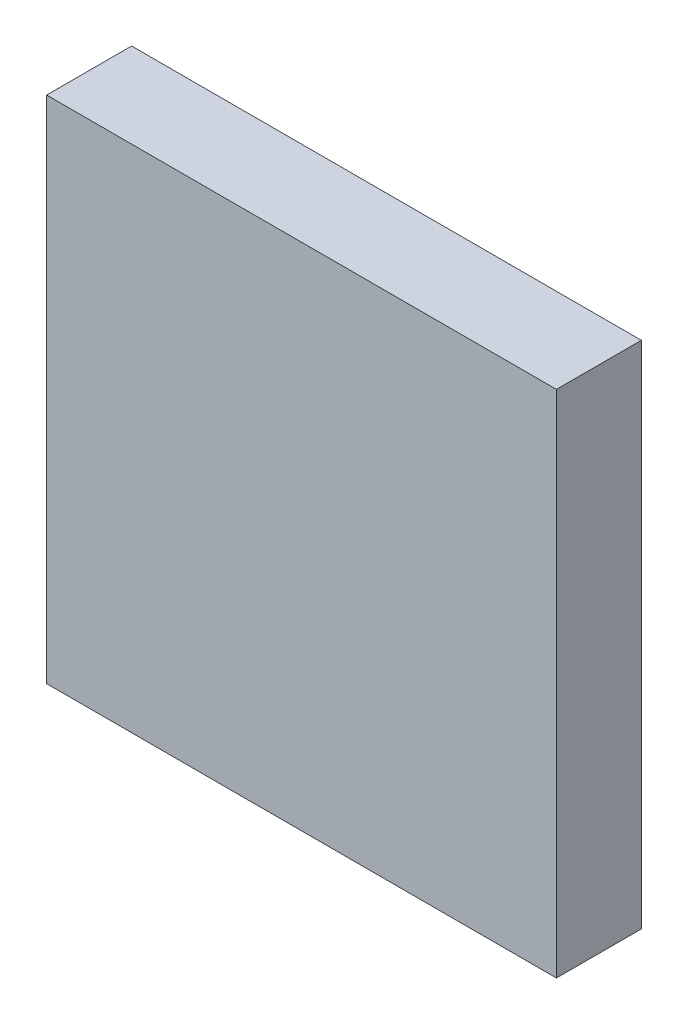
ISO-10303-21;
HEADER;
FILE_DESCRIPTION(('STEP AP214'),'2;1');
FILE_NAME('part.step','',(''),(''),'','','');
FILE_SCHEMA(('AUTOMOTIVE_DESIGN { 1 0 10303 214 1 1 1 1 }'));
ENDSEC;
DATA;
#1=APPLICATION_CONTEXT('core data for automotive mechanical design processes');
#2=APPLICATION_PROTOCOL_DEFINITION('international standard','automotive_design',2000,#1);
#3=PRODUCT_CONTEXT('',#1,'mechanical');
#4=PRODUCT('Part','Part','',(#3));
#5=PRODUCT_RELATED_PRODUCT_CATEGORY('part','',(#4));
#6=PRODUCT_DEFINITION_FORMATION('','',#4);
#7=PRODUCT_DEFINITION_CONTEXT('part definition',#1,'design');
#8=PRODUCT_DEFINITION('design','',#6,#7);
#9=PRODUCT_DEFINITION_SHAPE('','',#8);
#10=(LENGTH_UNIT() NAMED_UNIT(*) SI_UNIT(.MILLI.,.METRE.));
#11=(NAMED_UNIT(*) PLANE_ANGLE_UNIT() SI_UNIT($,.RADIAN.));
#12=(NAMED_UNIT(*) SI_UNIT($,.STERADIAN.) SOLID_ANGLE_UNIT());
#13=UNCERTAINTY_MEASURE_WITH_UNIT(LENGTH_MEASURE(1.E-05),#10,'distance_accuracy_value','');
#14=(GEOMETRIC_REPRESENTATION_CONTEXT(3) GLOBAL_UNCERTAINTY_ASSIGNED_CONTEXT((#13)) GLOBAL_UNIT_ASSIGNED_CONTEXT((#10,
#11,#12)) REPRESENTATION_CONTEXT('',''));
#15=CARTESIAN_POINT('',(0.,0.,0.));
#16=DIRECTION('',(0.,0.,1.));
#17=DIRECTION('',(1.,0.,0.));
#18=AXIS2_PLACEMENT_3D('',#15,#16,#17);
#19=CARTESIAN_POINT('',(-6.,-6.,0.));
#20=DIRECTION('',(0.,0.,1.));
#21=DIRECTION('',(1.,0.,0.));
#22=AXIS2_PLACEMENT_3D('',#19,#20,#21);
#23=PLANE('',#22);
#24=DIRECTION('',(0.,-1.,0.));
#25=VECTOR('',#24,1.);
#26=CARTESIAN_POINT('',(-6.,6.,0.));
#27=LINE('',#26,#25);
#28=CARTESIAN_POINT('',(-6.,6.,0.));
#29=VERTEX_POINT('',#28);
#30=CARTESIAN_POINT('',(-6.,-6.,0.));
#31=VERTEX_POINT('',#30);
#32=EDGE_CURVE('E117',#29,#31,#27,.T.);
#33=ORIENTED_EDGE('',*,*,#32,.F.);
#34=DIRECTION('',(-1.,0.,0.));
#35=VECTOR('',#34,1.);
#36=CARTESIAN_POINT('',(-6.,6.,0.));
#37=LINE('',#36,#35);
#38=CARTESIAN_POINT('',(6.,6.,0.));
#39=VERTEX_POINT('',#38);
#40=EDGE_CURVE('E130',#39,#29,#37,.T.);
#41=ORIENTED_EDGE('',*,*,#40,.F.);
#42=DIRECTION('',(0.,1.,0.));
#43=VECTOR('',#42,1.);
#44=CARTESIAN_POINT('',(6.,6.,0.));
#45=LINE('',#44,#43);
#46=CARTESIAN_POINT('',(6.,-6.,0.));
#47=VERTEX_POINT('',#46);
#48=EDGE_CURVE('E138',#47,#39,#45,.T.);
#49=ORIENTED_EDGE('',*,*,#48,.F.);
#50=DIRECTION('',(1.,0.,0.));
#51=VECTOR('',#50,1.);
#52=CARTESIAN_POINT('',(-6.,-6.,0.));
#53=LINE('',#52,#51);
#54=EDGE_CURVE('E120',#31,#47,#53,.T.);
#55=ORIENTED_EDGE('',*,*,#54,.F.);
#56=EDGE_LOOP('',(#33,#41,#49,#55));
#57=FACE_BOUND('',#56,.T.);
#58=DIRECTION('',(0.,-1.,0.));
#59=VECTOR('',#58,1.);
#60=CARTESIAN_POINT('',(2.,2.,0.));
#61=LINE('',#60,#59);
#62=CARTESIAN_POINT('',(2.,2.,0.));
#63=VERTEX_POINT('',#62);
#64=CARTESIAN_POINT('',(2.,-2.,0.));
#65=VERTEX_POINT('',#64);
#66=EDGE_CURVE('E116',#63,#65,#61,.T.);
#67=ORIENTED_EDGE('',*,*,#66,.F.);
#68=DIRECTION('',(1.,0.,0.));
#69=VECTOR('',#68,1.);
#70=CARTESIAN_POINT('',(2.,2.,0.));
#71=LINE('',#70,#69);
#72=CARTESIAN_POINT('',(-2.,2.,0.));
#73=VERTEX_POINT('',#72);
#74=EDGE_CURVE('E113',#73,#63,#71,.T.);
#75=ORIENTED_EDGE('',*,*,#74,.F.);
#76=DIRECTION('',(0.,1.,0.));
#77=VECTOR('',#76,1.);
#78=CARTESIAN_POINT('',(-2.,2.,0.));
#79=LINE('',#78,#77);
#80=CARTESIAN_POINT('',(-2.,-2.,0.));
#81=VERTEX_POINT('',#80);
#82=EDGE_CURVE('E51',#81,#73,#79,.T.);
#83=ORIENTED_EDGE('',*,*,#82,.F.);
#84=DIRECTION('',(-1.,0.,0.));
#85=VECTOR('',#84,1.);
#86=CARTESIAN_POINT('',(2.,-2.,0.));
#87=LINE('',#86,#85);
#88=EDGE_CURVE('E46',#65,#81,#87,.T.);
#89=ORIENTED_EDGE('',*,*,#88,.F.);
#90=EDGE_LOOP('',(#67,#75,#83,#89));
#91=FACE_BOUND('',#90,.T.);
#92=ADVANCED_FACE('F31',(#57,#91),#23,.F.);
#93=CARTESIAN_POINT('',(-6.,6.,2.));
#94=DIRECTION('',(1.,0.,0.));
#95=DIRECTION('',(0.,1.,0.));
#96=AXIS2_PLACEMENT_3D('',#93,#94,#95);
#97=PLANE('',#96);
#98=ORIENTED_EDGE('',*,*,#32,.T.);
#99=DIRECTION('',(0.,0.,-1.));
#100=VECTOR('',#99,1.);
#101=CARTESIAN_POINT('',(-6.,-6.,2.));
#102=LINE('',#101,#100);
#103=CARTESIAN_POINT('',(-6.,-6.,2.));
#104=VERTEX_POINT('',#103);
#105=EDGE_CURVE('E11',#104,#31,#102,.T.);
#106=ORIENTED_EDGE('',*,*,#105,.F.);
#107=DIRECTION('',(0.,-1.,0.));
#108=VECTOR('',#107,1.);
#109=CARTESIAN_POINT('',(-6.,6.,2.));
#110=LINE('',#109,#108);
#111=CARTESIAN_POINT('',(-6.,6.,2.));
#112=VERTEX_POINT('',#111);
#113=EDGE_CURVE('E126',#112,#104,#110,.T.);
#114=ORIENTED_EDGE('',*,*,#113,.F.);
#115=DIRECTION('',(0.,0.,-1.));
#116=VECTOR('',#115,1.);
#117=CARTESIAN_POINT('',(-6.,6.,2.));
#118=LINE('',#117,#116);
#119=EDGE_CURVE('E135',#112,#29,#118,.T.);
#120=ORIENTED_EDGE('',*,*,#119,.T.);
#121=EDGE_LOOP('',(#98,#106,#114,#120));
#122=FACE_BOUND('',#121,.T.);
#123=ADVANCED_FACE('F33',(#122),#97,.F.);
#124=CARTESIAN_POINT('',(-6.,-6.,2.));
#125=DIRECTION('',(0.,1.,0.));
#126=DIRECTION('',(0.,0.,1.));
#127=AXIS2_PLACEMENT_3D('',#124,#125,#126);
#128=PLANE('',#127);
#129=ORIENTED_EDGE('',*,*,#54,.T.);
#130=DIRECTION('',(0.,0.,-1.));
#131=VECTOR('',#130,1.);
#132=CARTESIAN_POINT('',(6.,-6.,2.));
#133=LINE('',#132,#131);
#134=CARTESIAN_POINT('',(6.,-6.,2.));
#135=VERTEX_POINT('',#134);
#136=EDGE_CURVE('E39',#135,#47,#133,.T.);
#137=ORIENTED_EDGE('',*,*,#136,.F.);
#138=DIRECTION('',(1.,0.,0.));
#139=VECTOR('',#138,1.);
#140=CARTESIAN_POINT('',(-6.,-6.,2.));
#141=LINE('',#140,#139);
#142=EDGE_CURVE('E129',#104,#135,#141,.T.);
#143=ORIENTED_EDGE('',*,*,#142,.F.);
#144=ORIENTED_EDGE('',*,*,#105,.T.);
#145=EDGE_LOOP('',(#129,#137,#143,#144));
#146=FACE_BOUND('',#145,.T.);
#147=ADVANCED_FACE('F165',(#146),#128,.F.);
#148=CARTESIAN_POINT('',(6.,6.,2.));
#149=DIRECTION('',(-1.,0.,0.));
#150=DIRECTION('',(0.,-1.,0.));
#151=AXIS2_PLACEMENT_3D('',#148,#149,#150);
#152=PLANE('',#151);
#153=ORIENTED_EDGE('',*,*,#48,.T.);
#154=DIRECTION('',(0.,0.,-1.));
#155=VECTOR('',#154,1.);
#156=CARTESIAN_POINT('',(6.,6.,2.));
#157=LINE('',#156,#155);
#158=CARTESIAN_POINT('',(6.,6.,2.));
#159=VERTEX_POINT('',#158);
#160=EDGE_CURVE('E143',#159,#39,#157,.T.);
#161=ORIENTED_EDGE('',*,*,#160,.F.);
#162=DIRECTION('',(0.,1.,0.));
#163=VECTOR('',#162,1.);
#164=CARTESIAN_POINT('',(6.,6.,2.));
#165=LINE('',#164,#163);
#166=EDGE_CURVE('E132',#135,#159,#165,.T.);
#167=ORIENTED_EDGE('',*,*,#166,.F.);
#168=ORIENTED_EDGE('',*,*,#136,.T.);
#169=EDGE_LOOP('',(#153,#161,#167,#168));
#170=FACE_BOUND('',#169,.T.);
#171=ADVANCED_FACE('F150',(#170),#152,.F.);
#172=CARTESIAN_POINT('',(-6.,6.,2.));
#173=DIRECTION('',(0.,-1.,0.));
#174=DIRECTION('',(0.,0.,-1.));
#175=AXIS2_PLACEMENT_3D('',#172,#173,#174);
#176=PLANE('',#175);
#177=ORIENTED_EDGE('',*,*,#40,.T.);
#178=ORIENTED_EDGE('',*,*,#119,.F.);
#179=DIRECTION('',(-1.,0.,0.));
#180=VECTOR('',#179,1.);
#181=CARTESIAN_POINT('',(-6.,6.,2.));
#182=LINE('',#181,#180);
#183=EDGE_CURVE('E134',#159,#112,#182,.T.);
#184=ORIENTED_EDGE('',*,*,#183,.F.);
#185=ORIENTED_EDGE('',*,*,#160,.T.);
#186=EDGE_LOOP('',(#177,#178,#184,#185));
#187=FACE_BOUND('',#186,.T.);
#188=ADVANCED_FACE('F158',(#187),#176,.F.);
#189=CARTESIAN_POINT('',(-6.,-6.,2.));
#190=DIRECTION('',(0.,0.,1.));
#191=DIRECTION('',(1.,0.,0.));
#192=AXIS2_PLACEMENT_3D('',#189,#190,#191);
#193=PLANE('',#192);
#194=ORIENTED_EDGE('',*,*,#113,.T.);
#195=ORIENTED_EDGE('',*,*,#142,.T.);
#196=ORIENTED_EDGE('',*,*,#166,.T.);
#197=ORIENTED_EDGE('',*,*,#183,.T.);
#198=EDGE_LOOP('',(#194,#195,#196,#197));
#199=FACE_BOUND('',#198,.T.);
#200=ADVANCED_FACE('F164',(#199),#193,.T.);
#201=CARTESIAN_POINT('',(2.,2.,-4.));
#202=DIRECTION('',(-1.,0.,0.));
#203=DIRECTION('',(0.,-1.,0.));
#204=AXIS2_PLACEMENT_3D('',#201,#202,#203);
#205=PLANE('',#204);
#206=ORIENTED_EDGE('',*,*,#66,.T.);
#207=DIRECTION('',(0.,0.,1.));
#208=VECTOR('',#207,1.);
#209=CARTESIAN_POINT('',(2.,-2.,-4.));
#210=LINE('',#209,#208);
#211=CARTESIAN_POINT('',(2.,-2.,-4.));
#212=VERTEX_POINT('',#211);
#213=EDGE_CURVE('E97',#212,#65,#210,.T.);
#214=ORIENTED_EDGE('',*,*,#213,.F.);
#215=DIRECTION('',(0.,-1.,0.));
#216=VECTOR('',#215,1.);
#217=CARTESIAN_POINT('',(2.,2.,-4.));
#218=LINE('',#217,#216);
#219=CARTESIAN_POINT('',(2.,2.,-4.));
#220=VERTEX_POINT('',#219);
#221=EDGE_CURVE('E104',#220,#212,#218,.T.);
#222=ORIENTED_EDGE('',*,*,#221,.F.);
#223=DIRECTION('',(0.,0.,1.));
#224=VECTOR('',#223,1.);
#225=CARTESIAN_POINT('',(2.,2.,-4.));
#226=LINE('',#225,#224);
#227=EDGE_CURVE('E258',#220,#63,#226,.T.);
#228=ORIENTED_EDGE('',*,*,#227,.T.);
#229=EDGE_LOOP('',(#206,#214,#222,#228));
#230=FACE_BOUND('',#229,.T.);
#231=ADVANCED_FACE('F115',(#230),#205,.F.);
#232=CARTESIAN_POINT('',(2.,-2.,-4.));
#233=DIRECTION('',(0.,1.,0.));
#234=DIRECTION('',(0.,0.,1.));
#235=AXIS2_PLACEMENT_3D('',#232,#233,#234);
#236=PLANE('',#235);
#237=ORIENTED_EDGE('',*,*,#88,.T.);
#238=DIRECTION('',(0.,0.,1.));
#239=VECTOR('',#238,1.);
#240=CARTESIAN_POINT('',(-2.,-2.,-4.));
#241=LINE('',#240,#239);
#242=CARTESIAN_POINT('',(-2.,-2.,-4.));
#243=VERTEX_POINT('',#242);
#244=EDGE_CURVE('E100',#243,#81,#241,.T.);
#245=ORIENTED_EDGE('',*,*,#244,.F.);
#246=DIRECTION('',(-1.,0.,0.));
#247=VECTOR('',#246,1.);
#248=CARTESIAN_POINT('',(2.,-2.,-4.));
#249=LINE('',#248,#247);
#250=EDGE_CURVE('E93',#212,#243,#249,.T.);
#251=ORIENTED_EDGE('',*,*,#250,.F.);
#252=ORIENTED_EDGE('',*,*,#213,.T.);
#253=EDGE_LOOP('',(#237,#245,#251,#252));
#254=FACE_BOUND('',#253,.T.);
#255=ADVANCED_FACE('F95',(#254),#236,.F.);
#256=CARTESIAN_POINT('',(-2.,2.,-4.));
#257=DIRECTION('',(1.,0.,0.));
#258=DIRECTION('',(0.,1.,0.));
#259=AXIS2_PLACEMENT_3D('',#256,#257,#258);
#260=PLANE('',#259);
#261=ORIENTED_EDGE('',*,*,#82,.T.);
#262=DIRECTION('',(0.,0.,1.));
#263=VECTOR('',#262,1.);
#264=CARTESIAN_POINT('',(-2.,2.,-4.));
#265=LINE('',#264,#263);
#266=CARTESIAN_POINT('',(-2.,2.,-4.));
#267=VERTEX_POINT('',#266);
#268=EDGE_CURVE('E122',#267,#73,#265,.T.);
#269=ORIENTED_EDGE('',*,*,#268,.F.);
#270=DIRECTION('',(0.,1.,0.));
#271=VECTOR('',#270,1.);
#272=CARTESIAN_POINT('',(-2.,2.,-4.));
#273=LINE('',#272,#271);
#274=EDGE_CURVE('E103',#243,#267,#273,.T.);
#275=ORIENTED_EDGE('',*,*,#274,.F.);
#276=ORIENTED_EDGE('',*,*,#244,.T.);
#277=EDGE_LOOP('',(#261,#269,#275,#276));
#278=FACE_BOUND('',#277,.T.);
#279=ADVANCED_FACE('F189',(#278),#260,.F.);
#280=CARTESIAN_POINT('',(2.,2.,-4.));
#281=DIRECTION('',(0.,-1.,0.));
#282=DIRECTION('',(0.,0.,-1.));
#283=AXIS2_PLACEMENT_3D('',#280,#281,#282);
#284=PLANE('',#283);
#285=ORIENTED_EDGE('',*,*,#74,.T.);
#286=ORIENTED_EDGE('',*,*,#227,.F.);
#287=DIRECTION('',(1.,0.,0.));
#288=VECTOR('',#287,1.);
#289=CARTESIAN_POINT('',(2.,2.,-4.));
#290=LINE('',#289,#288);
#291=EDGE_CURVE('E109',#267,#220,#290,.T.);
#292=ORIENTED_EDGE('',*,*,#291,.F.);
#293=ORIENTED_EDGE('',*,*,#268,.T.);
#294=EDGE_LOOP('',(#285,#286,#292,#293));
#295=FACE_BOUND('',#294,.T.);
#296=ADVANCED_FACE('F194',(#295),#284,.F.);
#297=CARTESIAN_POINT('',(2.,-2.,-4.));
#298=DIRECTION('',(0.,0.,-1.));
#299=DIRECTION('',(-1.,0.,0.));
#300=AXIS2_PLACEMENT_3D('',#297,#298,#299);
#301=PLANE('',#300);
#302=ORIENTED_EDGE('',*,*,#221,.T.);
#303=ORIENTED_EDGE('',*,*,#250,.T.);
#304=ORIENTED_EDGE('',*,*,#274,.T.);
#305=ORIENTED_EDGE('',*,*,#291,.T.);
#306=EDGE_LOOP('',(#302,#303,#304,#305));
#307=FACE_BOUND('',#306,.T.);
#308=ADVANCED_FACE('F107',(#307),#301,.T.);
#309=CLOSED_SHELL('',(#92,#123,#147,#171,#188,#200,#231,#255,#279,#296,#308));
#310=MANIFOLD_SOLID_BREP('B2',#309);
#311=ADVANCED_BREP_SHAPE_REPRESENTATION('',(#18,#310),#14);
#312=SHAPE_DEFINITION_REPRESENTATION(#9,#311);
ENDSEC;
END-ISO-10303-21;
